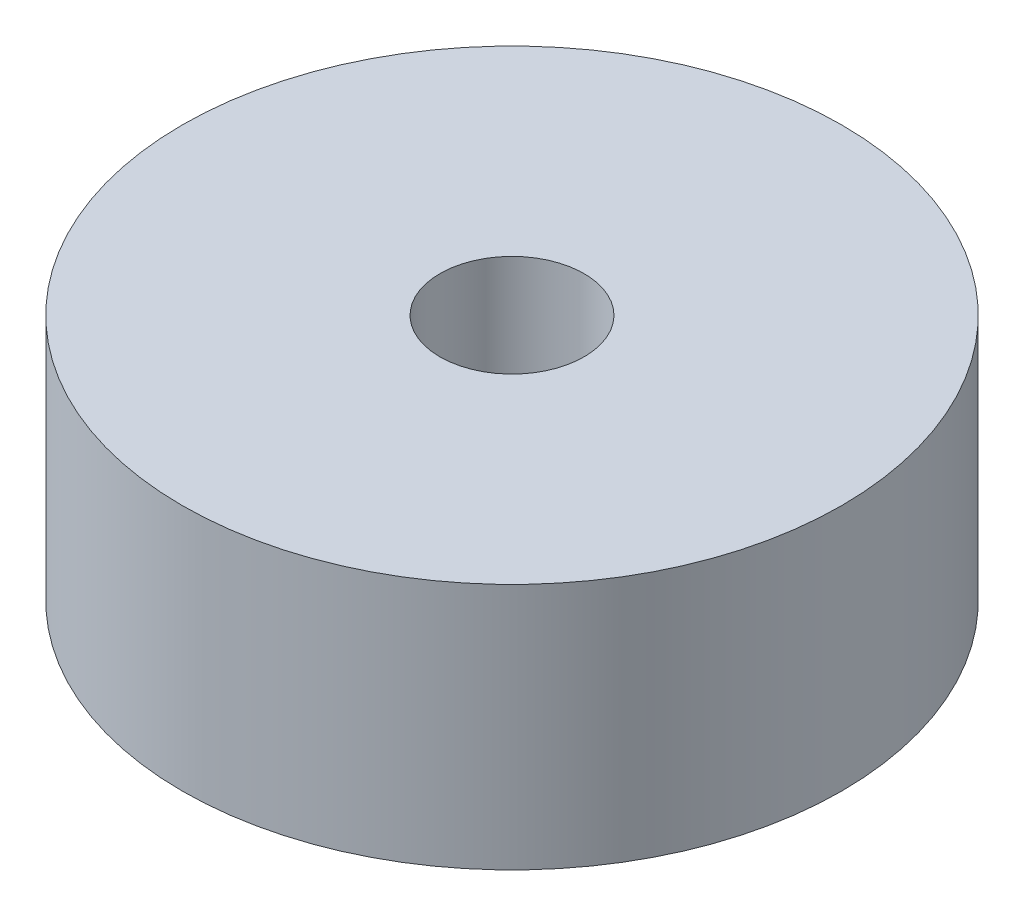
ISO-10303-21;
HEADER;
FILE_DESCRIPTION(('STEP AP214'),'2;1');
FILE_NAME('part.step','',(''),(''),'','','');
FILE_SCHEMA(('AUTOMOTIVE_DESIGN { 1 0 10303 214 1 1 1 1 }'));
ENDSEC;
DATA;
#1=APPLICATION_CONTEXT('core data for automotive mechanical design processes');
#2=APPLICATION_PROTOCOL_DEFINITION('international standard','automotive_design',2000,#1);
#3=PRODUCT_CONTEXT('',#1,'mechanical');
#4=PRODUCT('Part','Part','',(#3));
#5=PRODUCT_RELATED_PRODUCT_CATEGORY('part','',(#4));
#6=PRODUCT_DEFINITION_FORMATION('','',#4);
#7=PRODUCT_DEFINITION_CONTEXT('part definition',#1,'design');
#8=PRODUCT_DEFINITION('design','',#6,#7);
#9=PRODUCT_DEFINITION_SHAPE('','',#8);
#10=(LENGTH_UNIT() NAMED_UNIT(*) SI_UNIT(.MILLI.,.METRE.));
#11=(NAMED_UNIT(*) PLANE_ANGLE_UNIT() SI_UNIT($,.RADIAN.));
#12=(NAMED_UNIT(*) SI_UNIT($,.STERADIAN.) SOLID_ANGLE_UNIT());
#13=UNCERTAINTY_MEASURE_WITH_UNIT(LENGTH_MEASURE(1.E-05),#10,'distance_accuracy_value','');
#14=(GEOMETRIC_REPRESENTATION_CONTEXT(3) GLOBAL_UNCERTAINTY_ASSIGNED_CONTEXT((#13)) GLOBAL_UNIT_ASSIGNED_CONTEXT((#10,
#11,#12)) REPRESENTATION_CONTEXT('',''));
#15=CARTESIAN_POINT('',(0.,0.,0.));
#16=DIRECTION('',(0.,0.,1.));
#17=DIRECTION('',(1.,0.,0.));
#18=AXIS2_PLACEMENT_3D('',#15,#16,#17);
#19=CARTESIAN_POINT('',(0.,3.,0.));
#20=DIRECTION('',(0.,-1.,0.));
#21=DIRECTION('',(0.,0.,-1.));
#22=AXIS2_PLACEMENT_3D('',#19,#20,#21);
#23=CYLINDRICAL_SURFACE('',#22,4.);
#24=CARTESIAN_POINT('',(0.,3.,0.));
#25=DIRECTION('',(0.,1.,0.));
#26=DIRECTION('',(0.,0.,1.));
#27=AXIS2_PLACEMENT_3D('',#24,#25,#26);
#28=CIRCLE('',#27,4.);
#29=CARTESIAN_POINT('',(0.,3.,4.));
#30=VERTEX_POINT('',#29);
#31=EDGE_CURVE('E10',#30,#30,#28,.T.);
#32=ORIENTED_EDGE('',*,*,#31,.F.);
#33=EDGE_LOOP('',(#32));
#34=FACE_BOUND('',#33,.T.);
#35=CARTESIAN_POINT('',(0.,0.,0.));
#36=DIRECTION('',(0.,1.,0.));
#37=DIRECTION('',(0.,0.,1.));
#38=AXIS2_PLACEMENT_3D('',#35,#36,#37);
#39=CIRCLE('',#38,4.);
#40=CARTESIAN_POINT('',(0.,0.,4.));
#41=VERTEX_POINT('',#40);
#42=EDGE_CURVE('E46',#41,#41,#39,.T.);
#43=ORIENTED_EDGE('',*,*,#42,.T.);
#44=EDGE_LOOP('',(#43));
#45=FACE_BOUND('',#44,.T.);
#46=ADVANCED_FACE('F43',(#34,#45),#23,.T.);
#47=CARTESIAN_POINT('',(0.,3.,0.));
#48=DIRECTION('',(0.,1.,0.));
#49=DIRECTION('',(0.,0.,1.));
#50=AXIS2_PLACEMENT_3D('',#47,#48,#49);
#51=PLANE('',#50);
#52=CARTESIAN_POINT('',(0.,3.,0.));
#53=DIRECTION('',(0.,1.,0.));
#54=DIRECTION('',(0.,0.,1.));
#55=AXIS2_PLACEMENT_3D('',#52,#53,#54);
#56=CIRCLE('',#55,0.875);
#57=CARTESIAN_POINT('',(0.,3.,0.875));
#58=VERTEX_POINT('',#57);
#59=EDGE_CURVE('E57',#58,#58,#56,.T.);
#60=ORIENTED_EDGE('',*,*,#59,.F.);
#61=EDGE_LOOP('',(#60));
#62=FACE_BOUND('',#61,.T.);
#63=ORIENTED_EDGE('',*,*,#31,.T.);
#64=EDGE_LOOP('',(#63));
#65=FACE_BOUND('',#64,.T.);
#66=ADVANCED_FACE('F74',(#62,#65),#51,.T.);
#67=CARTESIAN_POINT('',(0.,0.,0.));
#68=DIRECTION('',(0.,1.,0.));
#69=DIRECTION('',(0.,0.,1.));
#70=AXIS2_PLACEMENT_3D('',#67,#68,#69);
#71=PLANE('',#70);
#72=CARTESIAN_POINT('',(0.,0.,0.));
#73=DIRECTION('',(0.,1.,0.));
#74=DIRECTION('',(0.,0.,1.));
#75=AXIS2_PLACEMENT_3D('',#72,#73,#74);
#76=CIRCLE('',#75,0.875);
#77=CARTESIAN_POINT('',(0.,0.,0.875));
#78=VERTEX_POINT('',#77);
#79=EDGE_CURVE('E55',#78,#78,#76,.T.);
#80=ORIENTED_EDGE('',*,*,#79,.T.);
#81=EDGE_LOOP('',(#80));
#82=FACE_BOUND('',#81,.T.);
#83=ORIENTED_EDGE('',*,*,#42,.F.);
#84=EDGE_LOOP('',(#83));
#85=FACE_BOUND('',#84,.T.);
#86=ADVANCED_FACE('F65',(#82,#85),#71,.F.);
#87=CARTESIAN_POINT('',(0.,0.,0.));
#88=DIRECTION('',(0.,1.,0.));
#89=DIRECTION('',(0.,0.,1.));
#90=AXIS2_PLACEMENT_3D('',#87,#88,#89);
#91=CYLINDRICAL_SURFACE('',#90,0.875);
#92=ORIENTED_EDGE('',*,*,#79,.F.);
#93=EDGE_LOOP('',(#92));
#94=FACE_BOUND('',#93,.T.);
#95=ORIENTED_EDGE('',*,*,#59,.T.);
#96=EDGE_LOOP('',(#95));
#97=FACE_BOUND('',#96,.T.);
#98=ADVANCED_FACE('F68',(#94,#97),#91,.F.);
#99=CLOSED_SHELL('',(#46,#66,#86,#98));
#100=MANIFOLD_SOLID_BREP('B2',#99);
#101=ADVANCED_BREP_SHAPE_REPRESENTATION('',(#18,#100),#14);
#102=SHAPE_DEFINITION_REPRESENTATION(#9,#101);
ENDSEC;
END-ISO-10303-21;
